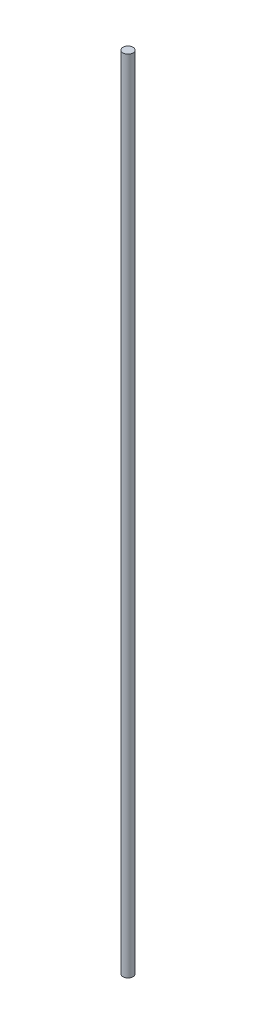
ISO-10303-21;
HEADER;
FILE_DESCRIPTION(('STEP AP214'),'2;1');
FILE_NAME('part.step','',(''),(''),'','','');
FILE_SCHEMA(('AUTOMOTIVE_DESIGN { 1 0 10303 214 1 1 1 1 }'));
ENDSEC;
DATA;
#1=APPLICATION_CONTEXT('core data for automotive mechanical design processes');
#2=APPLICATION_PROTOCOL_DEFINITION('international standard','automotive_design',2000,#1);
#3=PRODUCT_CONTEXT('',#1,'mechanical');
#4=PRODUCT('Part','Part','',(#3));
#5=PRODUCT_RELATED_PRODUCT_CATEGORY('part','',(#4));
#6=PRODUCT_DEFINITION_FORMATION('','',#4);
#7=PRODUCT_DEFINITION_CONTEXT('part definition',#1,'design');
#8=PRODUCT_DEFINITION('design','',#6,#7);
#9=PRODUCT_DEFINITION_SHAPE('','',#8);
#10=(LENGTH_UNIT() NAMED_UNIT(*) SI_UNIT(.MILLI.,.METRE.));
#11=(NAMED_UNIT(*) PLANE_ANGLE_UNIT() SI_UNIT($,.RADIAN.));
#12=(NAMED_UNIT(*) SI_UNIT($,.STERADIAN.) SOLID_ANGLE_UNIT());
#13=UNCERTAINTY_MEASURE_WITH_UNIT(LENGTH_MEASURE(1.E-05),#10,'distance_accuracy_value','');
#14=(GEOMETRIC_REPRESENTATION_CONTEXT(3) GLOBAL_UNCERTAINTY_ASSIGNED_CONTEXT((#13)) GLOBAL_UNIT_ASSIGNED_CONTEXT((#10,
#11,#12)) REPRESENTATION_CONTEXT('',''));
#15=CARTESIAN_POINT('',(0.,0.,0.));
#16=DIRECTION('',(0.,0.,1.));
#17=DIRECTION('',(1.,0.,0.));
#18=AXIS2_PLACEMENT_3D('',#15,#16,#17);
#19=CARTESIAN_POINT('',(0.,-160.,0.));
#20=DIRECTION('',(0.,1.,0.));
#21=DIRECTION('',(0.,0.,1.));
#22=AXIS2_PLACEMENT_3D('',#19,#20,#21);
#23=CYLINDRICAL_SURFACE('',#22,2.);
#24=CARTESIAN_POINT('',(0.,-160.,0.));
#25=DIRECTION('',(0.,1.,0.));
#26=DIRECTION('',(0.,0.,1.));
#27=AXIS2_PLACEMENT_3D('',#24,#25,#26);
#28=CIRCLE('',#27,2.);
#29=CARTESIAN_POINT('',(0.,-160.,2.));
#30=VERTEX_POINT('',#29);
#31=EDGE_CURVE('E10',#30,#30,#28,.T.);
#32=ORIENTED_EDGE('',*,*,#31,.T.);
#33=EDGE_LOOP('',(#32));
#34=FACE_BOUND('',#33,.T.);
#35=CARTESIAN_POINT('',(0.,160.,0.));
#36=DIRECTION('',(0.,1.,0.));
#37=DIRECTION('',(0.,0.,1.));
#38=AXIS2_PLACEMENT_3D('',#35,#36,#37);
#39=CIRCLE('',#38,2.);
#40=CARTESIAN_POINT('',(0.,160.,2.));
#41=VERTEX_POINT('',#40);
#42=EDGE_CURVE('E48',#41,#41,#39,.T.);
#43=ORIENTED_EDGE('',*,*,#42,.F.);
#44=EDGE_LOOP('',(#43));
#45=FACE_BOUND('',#44,.T.);
#46=ADVANCED_FACE('F41',(#34,#45),#23,.T.);
#47=CARTESIAN_POINT('',(0.,-160.,0.));
#48=DIRECTION('',(0.,1.,0.));
#49=DIRECTION('',(0.,0.,1.));
#50=AXIS2_PLACEMENT_3D('',#47,#48,#49);
#51=PLANE('',#50);
#52=ORIENTED_EDGE('',*,*,#31,.F.);
#53=EDGE_LOOP('',(#52));
#54=FACE_BOUND('',#53,.T.);
#55=ADVANCED_FACE('F58',(#54),#51,.F.);
#56=CARTESIAN_POINT('',(0.,160.,0.));
#57=DIRECTION('',(0.,1.,0.));
#58=DIRECTION('',(0.,0.,1.));
#59=AXIS2_PLACEMENT_3D('',#56,#57,#58);
#60=PLANE('',#59);
#61=ORIENTED_EDGE('',*,*,#42,.T.);
#62=EDGE_LOOP('',(#61));
#63=FACE_BOUND('',#62,.T.);
#64=ADVANCED_FACE('F55',(#63),#60,.T.);
#65=CLOSED_SHELL('',(#46,#55,#64));
#66=MANIFOLD_SOLID_BREP('B2',#65);
#67=ADVANCED_BREP_SHAPE_REPRESENTATION('',(#18,#66),#14);
#68=SHAPE_DEFINITION_REPRESENTATION(#9,#67);
ENDSEC;
END-ISO-10303-21;
